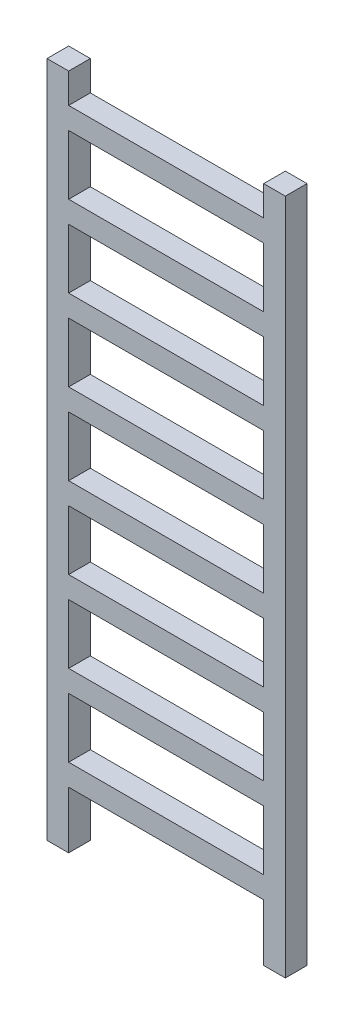
ISO-10303-21;
HEADER;
FILE_DESCRIPTION(('STEP AP214'),'2;1');
FILE_NAME('part.step','',(''),(''),'','','');
FILE_SCHEMA(('AUTOMOTIVE_DESIGN { 1 0 10303 214 1 1 1 1 }'));
ENDSEC;
DATA;
#1=APPLICATION_CONTEXT('core data for automotive mechanical design processes');
#2=APPLICATION_PROTOCOL_DEFINITION('international standard','automotive_design',2000,#1);
#3=PRODUCT_CONTEXT('',#1,'mechanical');
#4=PRODUCT('Part','Part','',(#3));
#5=PRODUCT_RELATED_PRODUCT_CATEGORY('part','',(#4));
#6=PRODUCT_DEFINITION_FORMATION('','',#4);
#7=PRODUCT_DEFINITION_CONTEXT('part definition',#1,'design');
#8=PRODUCT_DEFINITION('design','',#6,#7);
#9=PRODUCT_DEFINITION_SHAPE('','',#8);
#10=(LENGTH_UNIT() NAMED_UNIT(*) SI_UNIT(.MILLI.,.METRE.));
#11=(NAMED_UNIT(*) PLANE_ANGLE_UNIT() SI_UNIT($,.RADIAN.));
#12=(NAMED_UNIT(*) SI_UNIT($,.STERADIAN.) SOLID_ANGLE_UNIT());
#13=UNCERTAINTY_MEASURE_WITH_UNIT(LENGTH_MEASURE(1.E-05),#10,'distance_accuracy_value','');
#14=(GEOMETRIC_REPRESENTATION_CONTEXT(3) GLOBAL_UNCERTAINTY_ASSIGNED_CONTEXT((#13)) GLOBAL_UNIT_ASSIGNED_CONTEXT((#10,
#11,#12)) REPRESENTATION_CONTEXT('',''));
#15=CARTESIAN_POINT('',(0.,0.,0.));
#16=DIRECTION('',(0.,0.,1.));
#17=DIRECTION('',(1.,0.,0.));
#18=AXIS2_PLACEMENT_3D('',#15,#16,#17);
#19=CARTESIAN_POINT('',(-360.,-1250.,80.));
#20=DIRECTION('',(-1.,0.,0.));
#21=DIRECTION('',(0.,0.,1.));
#22=AXIS2_PLACEMENT_3D('',#19,#20,#21);
#23=PLANE('',#22);
#24=DIRECTION('',(0.,0.,1.));
#25=VECTOR('',#24,1.);
#26=CARTESIAN_POINT('',(-360.,-960.,80.));
#27=LINE('',#26,#25);
#28=CARTESIAN_POINT('',(-360.,-960.,0.));
#29=VERTEX_POINT('',#28);
#30=CARTESIAN_POINT('',(-360.,-960.,80.));
#31=VERTEX_POINT('',#30);
#32=EDGE_CURVE('E333',#29,#31,#27,.T.);
#33=ORIENTED_EDGE('',*,*,#32,.F.);
#34=DIRECTION('',(0.,1.,0.));
#35=VECTOR('',#34,1.);
#36=CARTESIAN_POINT('',(-360.,-1250.,0.));
#37=LINE('',#36,#35);
#38=CARTESIAN_POINT('',(-360.,-740.,0.));
#39=VERTEX_POINT('',#38);
#40=EDGE_CURVE('E537',#29,#39,#37,.T.);
#41=ORIENTED_EDGE('',*,*,#40,.T.);
#42=DIRECTION('',(0.,0.,-1.));
#43=VECTOR('',#42,1.);
#44=CARTESIAN_POINT('',(-360.,-740.,80.));
#45=LINE('',#44,#43);
#46=CARTESIAN_POINT('',(-360.,-740.,80.));
#47=VERTEX_POINT('',#46);
#48=EDGE_CURVE('E351',#47,#39,#45,.T.);
#49=ORIENTED_EDGE('',*,*,#48,.F.);
#50=DIRECTION('',(0.,1.,0.));
#51=VECTOR('',#50,1.);
#52=CARTESIAN_POINT('',(-360.,-1250.,80.));
#53=LINE('',#52,#51);
#54=EDGE_CURVE('E526',#31,#47,#53,.T.);
#55=ORIENTED_EDGE('',*,*,#54,.F.);
#56=EDGE_LOOP('',(#33,#41,#49,#55));
#57=FACE_BOUND('',#56,.T.);
#58=ADVANCED_FACE('F41',(#57),#23,.F.);
#59=DIRECTION('',(0.,0.,-1.));
#60=VECTOR('',#59,1.);
#61=CARTESIAN_POINT('',(-360.,-1040.,80.));
#62=LINE('',#61,#60);
#63=CARTESIAN_POINT('',(-360.,-1040.,80.));
#64=VERTEX_POINT('',#63);
#65=CARTESIAN_POINT('',(-360.,-1040.,0.));
#66=VERTEX_POINT('',#65);
#67=EDGE_CURVE('E317',#64,#66,#62,.T.);
#68=ORIENTED_EDGE('',*,*,#67,.F.);
#69=CARTESIAN_POINT('',(-360.,-1250.,80.));
#70=VERTEX_POINT('',#69);
#71=EDGE_CURVE('E522',#70,#64,#53,.T.);
#72=ORIENTED_EDGE('',*,*,#71,.F.);
#73=DIRECTION('',(0.,0.,-1.));
#74=VECTOR('',#73,1.);
#75=CARTESIAN_POINT('',(-360.,-1250.,80.));
#76=LINE('',#75,#74);
#77=CARTESIAN_POINT('',(-360.,-1250.,0.));
#78=VERTEX_POINT('',#77);
#79=EDGE_CURVE('E533',#70,#78,#76,.T.);
#80=ORIENTED_EDGE('',*,*,#79,.T.);
#81=EDGE_CURVE('E534',#78,#66,#37,.T.);
#82=ORIENTED_EDGE('',*,*,#81,.T.);
#83=EDGE_LOOP('',(#68,#72,#80,#82));
#84=FACE_BOUND('',#83,.T.);
#85=ADVANCED_FACE('F724',(#84),#23,.F.);
#86=CARTESIAN_POINT('',(360.,-1250.,80.));
#87=DIRECTION('',(1.,0.,0.));
#88=DIRECTION('',(0.,0.,-1.));
#89=AXIS2_PLACEMENT_3D('',#86,#87,#88);
#90=PLANE('',#89);
#91=DIRECTION('',(0.,0.,-1.));
#92=VECTOR('',#91,1.);
#93=CARTESIAN_POINT('',(360.,-960.,80.));
#94=LINE('',#93,#92);
#95=CARTESIAN_POINT('',(360.,-960.,80.));
#96=VERTEX_POINT('',#95);
#97=CARTESIAN_POINT('',(360.,-960.,0.));
#98=VERTEX_POINT('',#97);
#99=EDGE_CURVE('E64',#96,#98,#94,.T.);
#100=ORIENTED_EDGE('',*,*,#99,.F.);
#101=DIRECTION('',(0.,-1.,0.));
#102=VECTOR('',#101,1.);
#103=CARTESIAN_POINT('',(360.,-1250.,80.));
#104=LINE('',#103,#102);
#105=CARTESIAN_POINT('',(360.,-740.,80.));
#106=VERTEX_POINT('',#105);
#107=EDGE_CURVE('E607',#106,#96,#104,.T.);
#108=ORIENTED_EDGE('',*,*,#107,.F.);
#109=DIRECTION('',(0.,0.,1.));
#110=VECTOR('',#109,1.);
#111=CARTESIAN_POINT('',(360.,-740.,80.));
#112=LINE('',#111,#110);
#113=CARTESIAN_POINT('',(360.,-740.,0.));
#114=VERTEX_POINT('',#113);
#115=EDGE_CURVE('E344',#114,#106,#112,.T.);
#116=ORIENTED_EDGE('',*,*,#115,.F.);
#117=DIRECTION('',(0.,-1.,0.));
#118=VECTOR('',#117,1.);
#119=CARTESIAN_POINT('',(360.,-1250.,0.));
#120=LINE('',#119,#118);
#121=EDGE_CURVE('E308',#114,#98,#120,.T.);
#122=ORIENTED_EDGE('',*,*,#121,.T.);
#123=EDGE_LOOP('',(#100,#108,#116,#122));
#124=FACE_BOUND('',#123,.T.);
#125=ADVANCED_FACE('F594',(#124),#90,.F.);
#126=DIRECTION('',(0.,0.,1.));
#127=VECTOR('',#126,1.);
#128=CARTESIAN_POINT('',(360.,-1040.,80.));
#129=LINE('',#128,#127);
#130=CARTESIAN_POINT('',(360.,-1040.,0.));
#131=VERTEX_POINT('',#130);
#132=CARTESIAN_POINT('',(360.,-1040.,80.));
#133=VERTEX_POINT('',#132);
#134=EDGE_CURVE('E312',#131,#133,#129,.T.);
#135=ORIENTED_EDGE('',*,*,#134,.F.);
#136=CARTESIAN_POINT('',(360.,-1250.,0.));
#137=VERTEX_POINT('',#136);
#138=EDGE_CURVE('E299',#131,#137,#120,.T.);
#139=ORIENTED_EDGE('',*,*,#138,.T.);
#140=DIRECTION('',(0.,0.,-1.));
#141=VECTOR('',#140,1.);
#142=CARTESIAN_POINT('',(360.,-1250.,80.));
#143=LINE('',#142,#141);
#144=CARTESIAN_POINT('',(360.,-1250.,80.));
#145=VERTEX_POINT('',#144);
#146=EDGE_CURVE('E495',#145,#137,#143,.T.);
#147=ORIENTED_EDGE('',*,*,#146,.F.);
#148=EDGE_CURVE('E56',#133,#145,#104,.T.);
#149=ORIENTED_EDGE('',*,*,#148,.F.);
#150=EDGE_LOOP('',(#135,#139,#147,#149));
#151=FACE_BOUND('',#150,.T.);
#152=ADVANCED_FACE('F313',(#151),#90,.F.);
#153=DIRECTION('',(0.,0.,1.));
#154=VECTOR('',#153,1.);
#155=CARTESIAN_POINT('',(-360.,-660.,80.));
#156=LINE('',#155,#154);
#157=CARTESIAN_POINT('',(-360.,-660.,0.));
#158=VERTEX_POINT('',#157);
#159=CARTESIAN_POINT('',(-360.,-660.,80.));
#160=VERTEX_POINT('',#159);
#161=EDGE_CURVE('E357',#158,#160,#156,.T.);
#162=ORIENTED_EDGE('',*,*,#161,.F.);
#163=CARTESIAN_POINT('',(-360.,-440.,0.));
#164=VERTEX_POINT('',#163);
#165=EDGE_CURVE('E604',#158,#164,#37,.T.);
#166=ORIENTED_EDGE('',*,*,#165,.T.);
#167=DIRECTION('',(0.,0.,-1.));
#168=VECTOR('',#167,1.);
#169=CARTESIAN_POINT('',(-360.,-440.,80.));
#170=LINE('',#169,#168);
#171=CARTESIAN_POINT('',(-360.,-440.,80.));
#172=VERTEX_POINT('',#171);
#173=EDGE_CURVE('E375',#172,#164,#170,.T.);
#174=ORIENTED_EDGE('',*,*,#173,.F.);
#175=EDGE_CURVE('E678',#160,#172,#53,.T.);
#176=ORIENTED_EDGE('',*,*,#175,.F.);
#177=EDGE_LOOP('',(#162,#166,#174,#176));
#178=FACE_BOUND('',#177,.T.);
#179=ADVANCED_FACE('F701',(#178),#23,.F.);
#180=DIRECTION('',(0.,0.,-1.));
#181=VECTOR('',#180,1.);
#182=CARTESIAN_POINT('',(360.,-660.,80.));
#183=LINE('',#182,#181);
#184=CARTESIAN_POINT('',(360.,-660.,80.));
#185=VERTEX_POINT('',#184);
#186=CARTESIAN_POINT('',(360.,-660.,0.));
#187=VERTEX_POINT('',#186);
#188=EDGE_CURVE('E354',#185,#187,#183,.T.);
#189=ORIENTED_EDGE('',*,*,#188,.F.);
#190=CARTESIAN_POINT('',(360.,-440.,80.));
#191=VERTEX_POINT('',#190);
#192=EDGE_CURVE('E609',#191,#185,#104,.T.);
#193=ORIENTED_EDGE('',*,*,#192,.F.);
#194=DIRECTION('',(0.,0.,1.));
#195=VECTOR('',#194,1.);
#196=CARTESIAN_POINT('',(360.,-440.,80.));
#197=LINE('',#196,#195);
#198=CARTESIAN_POINT('',(360.,-440.,0.));
#199=VERTEX_POINT('',#198);
#200=EDGE_CURVE('E368',#199,#191,#197,.T.);
#201=ORIENTED_EDGE('',*,*,#200,.F.);
#202=EDGE_CURVE('E588',#199,#187,#120,.T.);
#203=ORIENTED_EDGE('',*,*,#202,.T.);
#204=EDGE_LOOP('',(#189,#193,#201,#203));
#205=FACE_BOUND('',#204,.T.);
#206=ADVANCED_FACE('F708',(#205),#90,.F.);
#207=DIRECTION('',(0.,0.,1.));
#208=VECTOR('',#207,1.);
#209=CARTESIAN_POINT('',(-360.,-360.,80.));
#210=LINE('',#209,#208);
#211=CARTESIAN_POINT('',(-360.,-360.,0.));
#212=VERTEX_POINT('',#211);
#213=CARTESIAN_POINT('',(-360.,-360.,80.));
#214=VERTEX_POINT('',#213);
#215=EDGE_CURVE('E381',#212,#214,#210,.T.);
#216=ORIENTED_EDGE('',*,*,#215,.F.);
#217=CARTESIAN_POINT('',(-360.,-140.,0.));
#218=VERTEX_POINT('',#217);
#219=EDGE_CURVE('E676',#212,#218,#37,.T.);
#220=ORIENTED_EDGE('',*,*,#219,.T.);
#221=DIRECTION('',(0.,0.,-1.));
#222=VECTOR('',#221,1.);
#223=CARTESIAN_POINT('',(-360.,-140.,80.));
#224=LINE('',#223,#222);
#225=CARTESIAN_POINT('',(-360.,-140.,80.));
#226=VERTEX_POINT('',#225);
#227=EDGE_CURVE('E399',#226,#218,#224,.T.);
#228=ORIENTED_EDGE('',*,*,#227,.F.);
#229=EDGE_CURVE('E677',#214,#226,#53,.T.);
#230=ORIENTED_EDGE('',*,*,#229,.F.);
#231=EDGE_LOOP('',(#216,#220,#228,#230));
#232=FACE_BOUND('',#231,.T.);
#233=ADVANCED_FACE('F674',(#232),#23,.F.);
#234=DIRECTION('',(0.,0.,-1.));
#235=VECTOR('',#234,1.);
#236=CARTESIAN_POINT('',(360.,-360.,80.));
#237=LINE('',#236,#235);
#238=CARTESIAN_POINT('',(360.,-360.,80.));
#239=VERTEX_POINT('',#238);
#240=CARTESIAN_POINT('',(360.,-360.,0.));
#241=VERTEX_POINT('',#240);
#242=EDGE_CURVE('E378',#239,#241,#237,.T.);
#243=ORIENTED_EDGE('',*,*,#242,.F.);
#244=CARTESIAN_POINT('',(360.,-140.,80.));
#245=VERTEX_POINT('',#244);
#246=EDGE_CURVE('E611',#245,#239,#104,.T.);
#247=ORIENTED_EDGE('',*,*,#246,.F.);
#248=DIRECTION('',(0.,0.,1.));
#249=VECTOR('',#248,1.);
#250=CARTESIAN_POINT('',(360.,-140.,80.));
#251=LINE('',#250,#249);
#252=CARTESIAN_POINT('',(360.,-140.,0.));
#253=VERTEX_POINT('',#252);
#254=EDGE_CURVE('E392',#253,#245,#251,.T.);
#255=ORIENTED_EDGE('',*,*,#254,.F.);
#256=EDGE_CURVE('E585',#253,#241,#120,.T.);
#257=ORIENTED_EDGE('',*,*,#256,.T.);
#258=EDGE_LOOP('',(#243,#247,#255,#257));
#259=FACE_BOUND('',#258,.T.);
#260=ADVANCED_FACE('F759',(#259),#90,.F.);
#261=DIRECTION('',(0.,0.,1.));
#262=VECTOR('',#261,1.);
#263=CARTESIAN_POINT('',(-360.,-60.0000000000001,80.));
#264=LINE('',#263,#262);
#265=CARTESIAN_POINT('',(-360.,-60.,0.));
#266=VERTEX_POINT('',#265);
#267=CARTESIAN_POINT('',(-360.,-60.0000000000001,80.));
#268=VERTEX_POINT('',#267);
#269=EDGE_CURVE('E405',#266,#268,#264,.T.);
#270=ORIENTED_EDGE('',*,*,#269,.F.);
#271=CARTESIAN_POINT('',(-360.,160.,0.));
#272=VERTEX_POINT('',#271);
#273=EDGE_CURVE('E695',#266,#272,#37,.T.);
#274=ORIENTED_EDGE('',*,*,#273,.T.);
#275=DIRECTION('',(0.,0.,-1.));
#276=VECTOR('',#275,1.);
#277=CARTESIAN_POINT('',(-360.,160.,80.));
#278=LINE('',#277,#276);
#279=CARTESIAN_POINT('',(-360.,160.,80.));
#280=VERTEX_POINT('',#279);
#281=EDGE_CURVE('E423',#280,#272,#278,.T.);
#282=ORIENTED_EDGE('',*,*,#281,.F.);
#283=EDGE_CURVE('E679',#268,#280,#53,.T.);
#284=ORIENTED_EDGE('',*,*,#283,.F.);
#285=EDGE_LOOP('',(#270,#274,#282,#284));
#286=FACE_BOUND('',#285,.T.);
#287=ADVANCED_FACE('F754',(#286),#23,.F.);
#288=DIRECTION('',(0.,0.,-1.));
#289=VECTOR('',#288,1.);
#290=CARTESIAN_POINT('',(360.,-60.0000000000001,80.));
#291=LINE('',#290,#289);
#292=CARTESIAN_POINT('',(360.,-60.0000000000001,80.));
#293=VERTEX_POINT('',#292);
#294=CARTESIAN_POINT('',(360.,-60.0000000000001,0.));
#295=VERTEX_POINT('',#294);
#296=EDGE_CURVE('E402',#293,#295,#291,.T.);
#297=ORIENTED_EDGE('',*,*,#296,.F.);
#298=CARTESIAN_POINT('',(360.,160.,80.));
#299=VERTEX_POINT('',#298);
#300=EDGE_CURVE('E659',#299,#293,#104,.T.);
#301=ORIENTED_EDGE('',*,*,#300,.F.);
#302=DIRECTION('',(0.,0.,1.));
#303=VECTOR('',#302,1.);
#304=CARTESIAN_POINT('',(360.,160.,80.));
#305=LINE('',#304,#303);
#306=CARTESIAN_POINT('',(360.,160.,0.));
#307=VERTEX_POINT('',#306);
#308=EDGE_CURVE('E416',#307,#299,#305,.T.);
#309=ORIENTED_EDGE('',*,*,#308,.F.);
#310=EDGE_CURVE('E582',#307,#295,#120,.T.);
#311=ORIENTED_EDGE('',*,*,#310,.T.);
#312=EDGE_LOOP('',(#297,#301,#309,#311));
#313=FACE_BOUND('',#312,.T.);
#314=ADVANCED_FACE('F752',(#313),#90,.F.);
#315=DIRECTION('',(0.,0.,1.));
#316=VECTOR('',#315,1.);
#317=CARTESIAN_POINT('',(-360.,240.,80.));
#318=LINE('',#317,#316);
#319=CARTESIAN_POINT('',(-360.,240.,0.));
#320=VERTEX_POINT('',#319);
#321=CARTESIAN_POINT('',(-360.,240.,80.));
#322=VERTEX_POINT('',#321);
#323=EDGE_CURVE('E429',#320,#322,#318,.T.);
#324=ORIENTED_EDGE('',*,*,#323,.F.);
#325=CARTESIAN_POINT('',(-360.,460.,0.));
#326=VERTEX_POINT('',#325);
#327=EDGE_CURVE('E686',#320,#326,#37,.T.);
#328=ORIENTED_EDGE('',*,*,#327,.T.);
#329=DIRECTION('',(0.,0.,-1.));
#330=VECTOR('',#329,1.);
#331=CARTESIAN_POINT('',(-360.,460.,80.));
#332=LINE('',#331,#330);
#333=CARTESIAN_POINT('',(-360.,460.,80.));
#334=VERTEX_POINT('',#333);
#335=EDGE_CURVE('E447',#334,#326,#332,.T.);
#336=ORIENTED_EDGE('',*,*,#335,.F.);
#337=EDGE_CURVE('E573',#322,#334,#53,.T.);
#338=ORIENTED_EDGE('',*,*,#337,.F.);
#339=EDGE_LOOP('',(#324,#328,#336,#338));
#340=FACE_BOUND('',#339,.T.);
#341=ADVANCED_FACE('F685',(#340),#23,.F.);
#342=DIRECTION('',(0.,0.,-1.));
#343=VECTOR('',#342,1.);
#344=CARTESIAN_POINT('',(360.,240.,80.));
#345=LINE('',#344,#343);
#346=CARTESIAN_POINT('',(360.,240.,80.));
#347=VERTEX_POINT('',#346);
#348=CARTESIAN_POINT('',(360.,240.,0.));
#349=VERTEX_POINT('',#348);
#350=EDGE_CURVE('E426',#347,#349,#345,.T.);
#351=ORIENTED_EDGE('',*,*,#350,.F.);
#352=CARTESIAN_POINT('',(360.,460.,80.));
#353=VERTEX_POINT('',#352);
#354=EDGE_CURVE('E657',#353,#347,#104,.T.);
#355=ORIENTED_EDGE('',*,*,#354,.F.);
#356=DIRECTION('',(0.,0.,1.));
#357=VECTOR('',#356,1.);
#358=CARTESIAN_POINT('',(360.,460.,80.));
#359=LINE('',#358,#357);
#360=CARTESIAN_POINT('',(360.,460.,0.));
#361=VERTEX_POINT('',#360);
#362=EDGE_CURVE('E440',#361,#353,#359,.T.);
#363=ORIENTED_EDGE('',*,*,#362,.F.);
#364=EDGE_CURVE('E581',#361,#349,#120,.T.);
#365=ORIENTED_EDGE('',*,*,#364,.T.);
#366=EDGE_LOOP('',(#351,#355,#363,#365));
#367=FACE_BOUND('',#366,.T.);
#368=ADVANCED_FACE('F690',(#367),#90,.F.);
#369=DIRECTION('',(0.,0.,1.));
#370=VECTOR('',#369,1.);
#371=CARTESIAN_POINT('',(-360.,540.,80.));
#372=LINE('',#371,#370);
#373=CARTESIAN_POINT('',(-360.,540.,0.));
#374=VERTEX_POINT('',#373);
#375=CARTESIAN_POINT('',(-360.,540.,80.));
#376=VERTEX_POINT('',#375);
#377=EDGE_CURVE('E453',#374,#376,#372,.T.);
#378=ORIENTED_EDGE('',*,*,#377,.F.);
#379=CARTESIAN_POINT('',(-360.,760.,0.));
#380=VERTEX_POINT('',#379);
#381=EDGE_CURVE('E576',#374,#380,#37,.T.);
#382=ORIENTED_EDGE('',*,*,#381,.T.);
#383=DIRECTION('',(0.,0.,-1.));
#384=VECTOR('',#383,1.);
#385=CARTESIAN_POINT('',(-360.,760.,80.));
#386=LINE('',#385,#384);
#387=CARTESIAN_POINT('',(-360.,760.,80.));
#388=VERTEX_POINT('',#387);
#389=EDGE_CURVE('E464',#388,#380,#386,.T.);
#390=ORIENTED_EDGE('',*,*,#389,.F.);
#391=EDGE_CURVE('E569',#376,#388,#53,.T.);
#392=ORIENTED_EDGE('',*,*,#391,.F.);
#393=EDGE_LOOP('',(#378,#382,#390,#392));
#394=FACE_BOUND('',#393,.T.);
#395=ADVANCED_FACE('F575',(#394),#23,.F.);
#396=DIRECTION('',(0.,0.,-1.));
#397=VECTOR('',#396,1.);
#398=CARTESIAN_POINT('',(360.,540.,80.));
#399=LINE('',#398,#397);
#400=CARTESIAN_POINT('',(360.,540.,80.));
#401=VERTEX_POINT('',#400);
#402=CARTESIAN_POINT('',(360.,540.,0.));
#403=VERTEX_POINT('',#402);
#404=EDGE_CURVE('E450',#401,#403,#399,.T.);
#405=ORIENTED_EDGE('',*,*,#404,.F.);
#406=CARTESIAN_POINT('',(360.,760.,80.));
#407=VERTEX_POINT('',#406);
#408=EDGE_CURVE('E567',#407,#401,#104,.T.);
#409=ORIENTED_EDGE('',*,*,#408,.F.);
#410=DIRECTION('',(0.,0.,1.));
#411=VECTOR('',#410,1.);
#412=CARTESIAN_POINT('',(360.,760.,80.));
#413=LINE('',#412,#411);
#414=CARTESIAN_POINT('',(360.,760.,0.));
#415=VERTEX_POINT('',#414);
#416=EDGE_CURVE('E49',#415,#407,#413,.T.);
#417=ORIENTED_EDGE('',*,*,#416,.F.);
#418=EDGE_CURVE('E580',#415,#403,#120,.T.);
#419=ORIENTED_EDGE('',*,*,#418,.T.);
#420=EDGE_LOOP('',(#405,#409,#417,#419));
#421=FACE_BOUND('',#420,.T.);
#422=ADVANCED_FACE('F740',(#421),#90,.F.);
#423=DIRECTION('',(0.,0.,1.));
#424=VECTOR('',#423,1.);
#425=CARTESIAN_POINT('',(-360.,840.,80.));
#426=LINE('',#425,#424);
#427=CARTESIAN_POINT('',(-360.,840.,0.));
#428=VERTEX_POINT('',#427);
#429=CARTESIAN_POINT('',(-360.,840.,80.));
#430=VERTEX_POINT('',#429);
#431=EDGE_CURVE('E471',#428,#430,#426,.T.);
#432=ORIENTED_EDGE('',*,*,#431,.F.);
#433=CARTESIAN_POINT('',(-360.,1060.,0.));
#434=VERTEX_POINT('',#433);
#435=EDGE_CURVE('E637',#428,#434,#37,.T.);
#436=ORIENTED_EDGE('',*,*,#435,.T.);
#437=DIRECTION('',(0.,0.,-1.));
#438=VECTOR('',#437,1.);
#439=CARTESIAN_POINT('',(-360.,1060.,80.));
#440=LINE('',#439,#438);
#441=CARTESIAN_POINT('',(-360.,1060.,80.));
#442=VERTEX_POINT('',#441);
#443=EDGE_CURVE('E513',#442,#434,#440,.T.);
#444=ORIENTED_EDGE('',*,*,#443,.F.);
#445=EDGE_CURVE('E574',#430,#442,#53,.T.);
#446=ORIENTED_EDGE('',*,*,#445,.F.);
#447=EDGE_LOOP('',(#432,#436,#444,#446));
#448=FACE_BOUND('',#447,.T.);
#449=ADVANCED_FACE('F647',(#448),#23,.F.);
#450=DIRECTION('',(0.,0.,-1.));
#451=VECTOR('',#450,1.);
#452=CARTESIAN_POINT('',(360.,840.,80.));
#453=LINE('',#452,#451);
#454=CARTESIAN_POINT('',(360.,840.,80.));
#455=VERTEX_POINT('',#454);
#456=CARTESIAN_POINT('',(360.,840.,0.));
#457=VERTEX_POINT('',#456);
#458=EDGE_CURVE('E11',#455,#457,#453,.T.);
#459=ORIENTED_EDGE('',*,*,#458,.F.);
#460=CARTESIAN_POINT('',(360.,1060.,80.));
#461=VERTEX_POINT('',#460);
#462=EDGE_CURVE('E484',#461,#455,#104,.T.);
#463=ORIENTED_EDGE('',*,*,#462,.F.);
#464=DIRECTION('',(0.,0.,-1.));
#465=VECTOR('',#464,1.);
#466=CARTESIAN_POINT('',(360.,1060.,80.));
#467=LINE('',#466,#465);
#468=CARTESIAN_POINT('',(360.,1060.,0.));
#469=VERTEX_POINT('',#468);
#470=EDGE_CURVE('E554',#461,#469,#467,.T.);
#471=ORIENTED_EDGE('',*,*,#470,.T.);
#472=EDGE_CURVE('E491',#469,#457,#120,.T.);
#473=ORIENTED_EDGE('',*,*,#472,.T.);
#474=EDGE_LOOP('',(#459,#463,#471,#473));
#475=FACE_BOUND('',#474,.T.);
#476=ADVANCED_FACE('F653',(#475),#90,.F.);
#477=CARTESIAN_POINT('',(-400.,1140.,80.));
#478=DIRECTION('',(0.,-1.,0.));
#479=DIRECTION('',(0.,0.,-1.));
#480=AXIS2_PLACEMENT_3D('',#477,#478,#479);
#481=PLANE('',#480);
#482=DIRECTION('',(0.,0.,1.));
#483=VECTOR('',#482,1.);
#484=CARTESIAN_POINT('',(360.,1140.,80.));
#485=LINE('',#484,#483);
#486=CARTESIAN_POINT('',(360.,1140.,0.));
#487=VERTEX_POINT('',#486);
#488=CARTESIAN_POINT('',(360.,1140.,80.));
#489=VERTEX_POINT('',#488);
#490=EDGE_CURVE('E503',#487,#489,#485,.T.);
#491=ORIENTED_EDGE('',*,*,#490,.F.);
#492=DIRECTION('',(-1.,0.,0.));
#493=VECTOR('',#492,1.);
#494=CARTESIAN_POINT('',(-400.,1140.,0.));
#495=LINE('',#494,#493);
#496=CARTESIAN_POINT('',(-360.,1140.,0.));
#497=VERTEX_POINT('',#496);
#498=EDGE_CURVE('E506',#487,#497,#495,.T.);
#499=ORIENTED_EDGE('',*,*,#498,.T.);
#500=DIRECTION('',(0.,0.,1.));
#501=VECTOR('',#500,1.);
#502=CARTESIAN_POINT('',(-360.,1140.,80.));
#503=LINE('',#502,#501);
#504=CARTESIAN_POINT('',(-360.,1140.,80.));
#505=VERTEX_POINT('',#504);
#506=EDGE_CURVE('E518',#497,#505,#503,.T.);
#507=ORIENTED_EDGE('',*,*,#506,.T.);
#508=DIRECTION('',(-1.,0.,0.));
#509=VECTOR('',#508,1.);
#510=CARTESIAN_POINT('',(-400.,1140.,80.));
#511=LINE('',#510,#509);
#512=EDGE_CURVE('E507',#489,#505,#511,.T.);
#513=ORIENTED_EDGE('',*,*,#512,.F.);
#514=EDGE_LOOP('',(#491,#499,#507,#513));
#515=FACE_BOUND('',#514,.T.);
#516=ADVANCED_FACE('F630',(#515),#481,.F.);
#517=CARTESIAN_POINT('',(-400.,1060.,80.));
#518=DIRECTION('',(0.,1.,0.));
#519=DIRECTION('',(0.,0.,1.));
#520=AXIS2_PLACEMENT_3D('',#517,#518,#519);
#521=PLANE('',#520);
#522=ORIENTED_EDGE('',*,*,#470,.F.);
#523=DIRECTION('',(1.,0.,0.));
#524=VECTOR('',#523,1.);
#525=CARTESIAN_POINT('',(-400.,1060.,80.));
#526=LINE('',#525,#524);
#527=EDGE_CURVE('E509',#442,#461,#526,.T.);
#528=ORIENTED_EDGE('',*,*,#527,.F.);
#529=ORIENTED_EDGE('',*,*,#443,.T.);
#530=DIRECTION('',(1.,0.,0.));
#531=VECTOR('',#530,1.);
#532=CARTESIAN_POINT('',(-400.,1060.,0.));
#533=LINE('',#532,#531);
#534=EDGE_CURVE('E510',#434,#469,#533,.T.);
#535=ORIENTED_EDGE('',*,*,#534,.T.);
#536=EDGE_LOOP('',(#522,#528,#529,#535));
#537=FACE_BOUND('',#536,.T.);
#538=ADVANCED_FACE('F650',(#537),#521,.F.);
#539=ORIENTED_EDGE('',*,*,#506,.F.);
#540=CARTESIAN_POINT('',(-360.,1250.,0.));
#541=VERTEX_POINT('',#540);
#542=EDGE_CURVE('E521',#497,#541,#37,.T.);
#543=ORIENTED_EDGE('',*,*,#542,.T.);
#544=DIRECTION('',(0.,0.,-1.));
#545=VECTOR('',#544,1.);
#546=CARTESIAN_POINT('',(-360.,1250.,80.));
#547=LINE('',#546,#545);
#548=CARTESIAN_POINT('',(-360.,1250.,80.));
#549=VERTEX_POINT('',#548);
#550=EDGE_CURVE('E551',#549,#541,#547,.T.);
#551=ORIENTED_EDGE('',*,*,#550,.F.);
#552=EDGE_CURVE('E527',#505,#549,#53,.T.);
#553=ORIENTED_EDGE('',*,*,#552,.F.);
#554=EDGE_LOOP('',(#539,#543,#551,#553));
#555=FACE_BOUND('',#554,.T.);
#556=ADVANCED_FACE('F43',(#555),#23,.F.);
#557=CARTESIAN_POINT('',(-440.,1250.,80.));
#558=DIRECTION('',(0.,-1.,0.));
#559=DIRECTION('',(0.,0.,-1.));
#560=AXIS2_PLACEMENT_3D('',#557,#558,#559);
#561=PLANE('',#560);
#562=DIRECTION('',(-1.,0.,0.));
#563=VECTOR('',#562,1.);
#564=CARTESIAN_POINT('',(-440.,1250.,0.));
#565=LINE('',#564,#563);
#566=CARTESIAN_POINT('',(-440.,1250.,0.));
#567=VERTEX_POINT('',#566);
#568=EDGE_CURVE('E536',#541,#567,#565,.T.);
#569=ORIENTED_EDGE('',*,*,#568,.T.);
#570=DIRECTION('',(0.,0.,-1.));
#571=VECTOR('',#570,1.);
#572=CARTESIAN_POINT('',(-440.,1250.,80.));
#573=LINE('',#572,#571);
#574=CARTESIAN_POINT('',(-440.,1250.,80.));
#575=VERTEX_POINT('',#574);
#576=EDGE_CURVE('E548',#575,#567,#573,.T.);
#577=ORIENTED_EDGE('',*,*,#576,.F.);
#578=DIRECTION('',(-1.,0.,0.));
#579=VECTOR('',#578,1.);
#580=CARTESIAN_POINT('',(-440.,1250.,80.));
#581=LINE('',#580,#579);
#582=EDGE_CURVE('E525',#549,#575,#581,.T.);
#583=ORIENTED_EDGE('',*,*,#582,.F.);
#584=ORIENTED_EDGE('',*,*,#550,.T.);
#585=EDGE_LOOP('',(#569,#577,#583,#584));
#586=FACE_BOUND('',#585,.T.);
#587=ADVANCED_FACE('F730',(#586),#561,.F.);
#588=CARTESIAN_POINT('',(-440.,-1250.,80.));
#589=DIRECTION('',(1.,0.,0.));
#590=DIRECTION('',(0.,0.,-1.));
#591=AXIS2_PLACEMENT_3D('',#588,#589,#590);
#592=PLANE('',#591);
#593=DIRECTION('',(0.,-1.,0.));
#594=VECTOR('',#593,1.);
#595=CARTESIAN_POINT('',(-440.,-1250.,0.));
#596=LINE('',#595,#594);
#597=CARTESIAN_POINT('',(-440.,-1250.,0.));
#598=VERTEX_POINT('',#597);
#599=EDGE_CURVE('E539',#567,#598,#596,.T.);
#600=ORIENTED_EDGE('',*,*,#599,.T.);
#601=DIRECTION('',(0.,0.,-1.));
#602=VECTOR('',#601,1.);
#603=CARTESIAN_POINT('',(-440.,-1250.,80.));
#604=LINE('',#603,#602);
#605=CARTESIAN_POINT('',(-440.,-1250.,80.));
#606=VERTEX_POINT('',#605);
#607=EDGE_CURVE('E545',#606,#598,#604,.T.);
#608=ORIENTED_EDGE('',*,*,#607,.F.);
#609=DIRECTION('',(0.,-1.,0.));
#610=VECTOR('',#609,1.);
#611=CARTESIAN_POINT('',(-440.,-1250.,80.));
#612=LINE('',#611,#610);
#613=EDGE_CURVE('E529',#575,#606,#612,.T.);
#614=ORIENTED_EDGE('',*,*,#613,.F.);
#615=ORIENTED_EDGE('',*,*,#576,.T.);
#616=EDGE_LOOP('',(#600,#608,#614,#615));
#617=FACE_BOUND('',#616,.T.);
#618=ADVANCED_FACE('F736',(#617),#592,.F.);
#619=CARTESIAN_POINT('',(-440.,-1250.,80.));
#620=DIRECTION('',(0.,1.,0.));
#621=DIRECTION('',(0.,0.,1.));
#622=AXIS2_PLACEMENT_3D('',#619,#620,#621);
#623=PLANE('',#622);
#624=DIRECTION('',(1.,0.,0.));
#625=VECTOR('',#624,1.);
#626=CARTESIAN_POINT('',(-440.,-1250.,0.));
#627=LINE('',#626,#625);
#628=EDGE_CURVE('E541',#598,#78,#627,.T.);
#629=ORIENTED_EDGE('',*,*,#628,.T.);
#630=ORIENTED_EDGE('',*,*,#79,.F.);
#631=DIRECTION('',(1.,0.,0.));
#632=VECTOR('',#631,1.);
#633=CARTESIAN_POINT('',(-440.,-1250.,80.));
#634=LINE('',#633,#632);
#635=EDGE_CURVE('E531',#606,#70,#634,.T.);
#636=ORIENTED_EDGE('',*,*,#635,.F.);
#637=ORIENTED_EDGE('',*,*,#607,.T.);
#638=EDGE_LOOP('',(#629,#630,#636,#637));
#639=FACE_BOUND('',#638,.T.);
#640=ADVANCED_FACE('F787',(#639),#623,.F.);
#641=CARTESIAN_POINT('',(0.,0.,80.));
#642=DIRECTION('',(0.,0.,-1.));
#643=DIRECTION('',(-1.,0.,0.));
#644=AXIS2_PLACEMENT_3D('',#641,#642,#643);
#645=PLANE('',#644);
#646=DIRECTION('',(-1.,0.,0.));
#647=VECTOR('',#646,1.);
#648=CARTESIAN_POINT('',(-400.,-960.,80.));
#649=LINE('',#648,#647);
#650=EDGE_CURVE('E322',#96,#31,#649,.T.);
#651=ORIENTED_EDGE('',*,*,#650,.T.);
#652=ORIENTED_EDGE('',*,*,#54,.T.);
#653=DIRECTION('',(1.,0.,0.));
#654=VECTOR('',#653,1.);
#655=CARTESIAN_POINT('',(-400.,-740.,80.));
#656=LINE('',#655,#654);
#657=EDGE_CURVE('E340',#47,#106,#656,.T.);
#658=ORIENTED_EDGE('',*,*,#657,.T.);
#659=ORIENTED_EDGE('',*,*,#107,.T.);
#660=EDGE_LOOP('',(#651,#652,#658,#659));
#661=FACE_BOUND('',#660,.T.);
#662=ORIENTED_EDGE('',*,*,#71,.T.);
#663=DIRECTION('',(1.,0.,0.));
#664=VECTOR('',#663,1.);
#665=CARTESIAN_POINT('',(-400.,-1040.,80.));
#666=LINE('',#665,#664);
#667=EDGE_CURVE('E318',#64,#133,#666,.T.);
#668=ORIENTED_EDGE('',*,*,#667,.T.);
#669=ORIENTED_EDGE('',*,*,#148,.T.);
#670=DIRECTION('',(1.,0.,0.));
#671=VECTOR('',#670,1.);
#672=CARTESIAN_POINT('',(360.,-1250.,80.));
#673=LINE('',#672,#671);
#674=CARTESIAN_POINT('',(440.,-1250.,80.));
#675=VERTEX_POINT('',#674);
#676=EDGE_CURVE('E483',#145,#675,#673,.T.);
#677=ORIENTED_EDGE('',*,*,#676,.T.);
#678=DIRECTION('',(0.,1.,0.));
#679=VECTOR('',#678,1.);
#680=CARTESIAN_POINT('',(440.,-1250.,80.));
#681=LINE('',#680,#679);
#682=CARTESIAN_POINT('',(440.,1250.,80.));
#683=VERTEX_POINT('',#682);
#684=EDGE_CURVE('E475',#675,#683,#681,.T.);
#685=ORIENTED_EDGE('',*,*,#684,.T.);
#686=DIRECTION('',(-1.,0.,0.));
#687=VECTOR('',#686,1.);
#688=CARTESIAN_POINT('',(360.,1250.,80.));
#689=LINE('',#688,#687);
#690=CARTESIAN_POINT('',(360.,1250.,80.));
#691=VERTEX_POINT('',#690);
#692=EDGE_CURVE('E478',#683,#691,#689,.T.);
#693=ORIENTED_EDGE('',*,*,#692,.T.);
#694=EDGE_CURVE('E480',#691,#489,#104,.T.);
#695=ORIENTED_EDGE('',*,*,#694,.T.);
#696=ORIENTED_EDGE('',*,*,#512,.T.);
#697=ORIENTED_EDGE('',*,*,#552,.T.);
#698=ORIENTED_EDGE('',*,*,#582,.T.);
#699=ORIENTED_EDGE('',*,*,#613,.T.);
#700=ORIENTED_EDGE('',*,*,#635,.T.);
#701=EDGE_LOOP('',(#662,#668,#669,#677,#685,#693,#695,#696,#697,#698,#699,#700));
#702=FACE_BOUND('',#701,.T.);
#703=DIRECTION('',(-1.,0.,0.));
#704=VECTOR('',#703,1.);
#705=CARTESIAN_POINT('',(-400.,-660.,80.));
#706=LINE('',#705,#704);
#707=EDGE_CURVE('E337',#185,#160,#706,.T.);
#708=ORIENTED_EDGE('',*,*,#707,.T.);
#709=ORIENTED_EDGE('',*,*,#175,.T.);
#710=DIRECTION('',(1.,0.,0.));
#711=VECTOR('',#710,1.);
#712=CARTESIAN_POINT('',(-400.,-440.,80.));
#713=LINE('',#712,#711);
#714=EDGE_CURVE('E364',#172,#191,#713,.T.);
#715=ORIENTED_EDGE('',*,*,#714,.T.);
#716=ORIENTED_EDGE('',*,*,#192,.T.);
#717=EDGE_LOOP('',(#708,#709,#715,#716));
#718=FACE_BOUND('',#717,.T.);
#719=DIRECTION('',(-1.,0.,0.));
#720=VECTOR('',#719,1.);
#721=CARTESIAN_POINT('',(-400.,-360.,80.));
#722=LINE('',#721,#720);
#723=EDGE_CURVE('E361',#239,#214,#722,.T.);
#724=ORIENTED_EDGE('',*,*,#723,.T.);
#725=ORIENTED_EDGE('',*,*,#229,.T.);
#726=DIRECTION('',(1.,0.,0.));
#727=VECTOR('',#726,1.);
#728=CARTESIAN_POINT('',(-400.,-140.,80.));
#729=LINE('',#728,#727);
#730=EDGE_CURVE('E388',#226,#245,#729,.T.);
#731=ORIENTED_EDGE('',*,*,#730,.T.);
#732=ORIENTED_EDGE('',*,*,#246,.T.);
#733=EDGE_LOOP('',(#724,#725,#731,#732));
#734=FACE_BOUND('',#733,.T.);
#735=DIRECTION('',(-1.,0.,0.));
#736=VECTOR('',#735,1.);
#737=CARTESIAN_POINT('',(-400.,-60.,80.));
#738=LINE('',#737,#736);
#739=EDGE_CURVE('E385',#293,#268,#738,.T.);
#740=ORIENTED_EDGE('',*,*,#739,.T.);
#741=ORIENTED_EDGE('',*,*,#283,.T.);
#742=DIRECTION('',(1.,0.,0.));
#743=VECTOR('',#742,1.);
#744=CARTESIAN_POINT('',(-400.,160.,80.));
#745=LINE('',#744,#743);
#746=EDGE_CURVE('E412',#280,#299,#745,.T.);
#747=ORIENTED_EDGE('',*,*,#746,.T.);
#748=ORIENTED_EDGE('',*,*,#300,.T.);
#749=EDGE_LOOP('',(#740,#741,#747,#748));
#750=FACE_BOUND('',#749,.T.);
#751=DIRECTION('',(-1.,0.,0.));
#752=VECTOR('',#751,1.);
#753=CARTESIAN_POINT('',(-400.,240.,80.));
#754=LINE('',#753,#752);
#755=EDGE_CURVE('E409',#347,#322,#754,.T.);
#756=ORIENTED_EDGE('',*,*,#755,.T.);
#757=ORIENTED_EDGE('',*,*,#337,.T.);
#758=DIRECTION('',(1.,0.,0.));
#759=VECTOR('',#758,1.);
#760=CARTESIAN_POINT('',(-400.,460.,80.));
#761=LINE('',#760,#759);
#762=EDGE_CURVE('E436',#334,#353,#761,.T.);
#763=ORIENTED_EDGE('',*,*,#762,.T.);
#764=ORIENTED_EDGE('',*,*,#354,.T.);
#765=EDGE_LOOP('',(#756,#757,#763,#764));
#766=FACE_BOUND('',#765,.T.);
#767=DIRECTION('',(-1.,0.,0.));
#768=VECTOR('',#767,1.);
#769=CARTESIAN_POINT('',(-400.,540.,80.));
#770=LINE('',#769,#768);
#771=EDGE_CURVE('E433',#401,#376,#770,.T.);
#772=ORIENTED_EDGE('',*,*,#771,.T.);
#773=ORIENTED_EDGE('',*,*,#391,.T.);
#774=DIRECTION('',(1.,0.,0.));
#775=VECTOR('',#774,1.);
#776=CARTESIAN_POINT('',(-400.,760.,80.));
#777=LINE('',#776,#775);
#778=EDGE_CURVE('E460',#388,#407,#777,.T.);
#779=ORIENTED_EDGE('',*,*,#778,.T.);
#780=ORIENTED_EDGE('',*,*,#408,.T.);
#781=EDGE_LOOP('',(#772,#773,#779,#780));
#782=FACE_BOUND('',#781,.T.);
#783=ORIENTED_EDGE('',*,*,#462,.T.);
#784=DIRECTION('',(-1.,0.,0.));
#785=VECTOR('',#784,1.);
#786=CARTESIAN_POINT('',(-400.,840.,80.));
#787=LINE('',#786,#785);
#788=EDGE_CURVE('E457',#455,#430,#787,.T.);
#789=ORIENTED_EDGE('',*,*,#788,.T.);
#790=ORIENTED_EDGE('',*,*,#445,.T.);
#791=ORIENTED_EDGE('',*,*,#527,.T.);
#792=EDGE_LOOP('',(#783,#789,#790,#791));
#793=FACE_BOUND('',#792,.T.);
#794=ADVANCED_FACE('F565',(#661,#702,#718,#734,#750,#766,#782,#793),#645,.F.);
#795=CARTESIAN_POINT('',(0.,0.,0.));
#796=DIRECTION('',(0.,0.,-1.));
#797=DIRECTION('',(-1.,0.,0.));
#798=AXIS2_PLACEMENT_3D('',#795,#796,#797);
#799=PLANE('',#798);
#800=ORIENTED_EDGE('',*,*,#40,.F.);
#801=DIRECTION('',(-1.,0.,0.));
#802=VECTOR('',#801,1.);
#803=CARTESIAN_POINT('',(-400.,-960.,0.));
#804=LINE('',#803,#802);
#805=EDGE_CURVE('E323',#98,#29,#804,.T.);
#806=ORIENTED_EDGE('',*,*,#805,.F.);
#807=ORIENTED_EDGE('',*,*,#121,.F.);
#808=DIRECTION('',(1.,0.,0.));
#809=VECTOR('',#808,1.);
#810=CARTESIAN_POINT('',(-400.,-740.,0.));
#811=LINE('',#810,#809);
#812=EDGE_CURVE('E341',#39,#114,#811,.T.);
#813=ORIENTED_EDGE('',*,*,#812,.F.);
#814=EDGE_LOOP('',(#800,#806,#807,#813));
#815=FACE_BOUND('',#814,.T.);
#816=ORIENTED_EDGE('',*,*,#138,.F.);
#817=DIRECTION('',(1.,0.,0.));
#818=VECTOR('',#817,1.);
#819=CARTESIAN_POINT('',(-400.,-1040.,0.));
#820=LINE('',#819,#818);
#821=EDGE_CURVE('E304',#66,#131,#820,.T.);
#822=ORIENTED_EDGE('',*,*,#821,.F.);
#823=ORIENTED_EDGE('',*,*,#81,.F.);
#824=ORIENTED_EDGE('',*,*,#628,.F.);
#825=ORIENTED_EDGE('',*,*,#599,.F.);
#826=ORIENTED_EDGE('',*,*,#568,.F.);
#827=ORIENTED_EDGE('',*,*,#542,.F.);
#828=ORIENTED_EDGE('',*,*,#498,.F.);
#829=CARTESIAN_POINT('',(360.,1250.,0.));
#830=VERTEX_POINT('',#829);
#831=EDGE_CURVE('E311',#830,#487,#120,.T.);
#832=ORIENTED_EDGE('',*,*,#831,.F.);
#833=DIRECTION('',(-1.,0.,0.));
#834=VECTOR('',#833,1.);
#835=CARTESIAN_POINT('',(360.,1250.,0.));
#836=LINE('',#835,#834);
#837=CARTESIAN_POINT('',(440.,1250.,0.));
#838=VERTEX_POINT('',#837);
#839=EDGE_CURVE('E309',#838,#830,#836,.T.);
#840=ORIENTED_EDGE('',*,*,#839,.F.);
#841=DIRECTION('',(0.,1.,0.));
#842=VECTOR('',#841,1.);
#843=CARTESIAN_POINT('',(440.,-1250.,0.));
#844=LINE('',#843,#842);
#845=CARTESIAN_POINT('',(440.,-1250.,0.));
#846=VERTEX_POINT('',#845);
#847=EDGE_CURVE('E474',#846,#838,#844,.T.);
#848=ORIENTED_EDGE('',*,*,#847,.F.);
#849=DIRECTION('',(1.,0.,0.));
#850=VECTOR('',#849,1.);
#851=CARTESIAN_POINT('',(360.,-1250.,0.));
#852=LINE('',#851,#850);
#853=EDGE_CURVE('E306',#137,#846,#852,.T.);
#854=ORIENTED_EDGE('',*,*,#853,.F.);
#855=EDGE_LOOP('',(#816,#822,#823,#824,#825,#826,#827,#828,#832,#840,#848,#854));
#856=FACE_BOUND('',#855,.T.);
#857=ORIENTED_EDGE('',*,*,#165,.F.);
#858=DIRECTION('',(-1.,0.,0.));
#859=VECTOR('',#858,1.);
#860=CARTESIAN_POINT('',(-400.,-660.,0.));
#861=LINE('',#860,#859);
#862=EDGE_CURVE('E336',#187,#158,#861,.T.);
#863=ORIENTED_EDGE('',*,*,#862,.F.);
#864=ORIENTED_EDGE('',*,*,#202,.F.);
#865=DIRECTION('',(1.,0.,0.));
#866=VECTOR('',#865,1.);
#867=CARTESIAN_POINT('',(-400.,-440.,0.));
#868=LINE('',#867,#866);
#869=EDGE_CURVE('E365',#164,#199,#868,.T.);
#870=ORIENTED_EDGE('',*,*,#869,.F.);
#871=EDGE_LOOP('',(#857,#863,#864,#870));
#872=FACE_BOUND('',#871,.T.);
#873=ORIENTED_EDGE('',*,*,#219,.F.);
#874=DIRECTION('',(-1.,0.,0.));
#875=VECTOR('',#874,1.);
#876=CARTESIAN_POINT('',(-400.,-360.,0.));
#877=LINE('',#876,#875);
#878=EDGE_CURVE('E360',#241,#212,#877,.T.);
#879=ORIENTED_EDGE('',*,*,#878,.F.);
#880=ORIENTED_EDGE('',*,*,#256,.F.);
#881=DIRECTION('',(1.,0.,0.));
#882=VECTOR('',#881,1.);
#883=CARTESIAN_POINT('',(-400.,-140.,0.));
#884=LINE('',#883,#882);
#885=EDGE_CURVE('E389',#218,#253,#884,.T.);
#886=ORIENTED_EDGE('',*,*,#885,.F.);
#887=EDGE_LOOP('',(#873,#879,#880,#886));
#888=FACE_BOUND('',#887,.T.);
#889=ORIENTED_EDGE('',*,*,#273,.F.);
#890=DIRECTION('',(-1.,0.,0.));
#891=VECTOR('',#890,1.);
#892=CARTESIAN_POINT('',(-400.,-60.,0.));
#893=LINE('',#892,#891);
#894=EDGE_CURVE('E384',#295,#266,#893,.T.);
#895=ORIENTED_EDGE('',*,*,#894,.F.);
#896=ORIENTED_EDGE('',*,*,#310,.F.);
#897=DIRECTION('',(1.,0.,0.));
#898=VECTOR('',#897,1.);
#899=CARTESIAN_POINT('',(-400.,160.,0.));
#900=LINE('',#899,#898);
#901=EDGE_CURVE('E413',#272,#307,#900,.T.);
#902=ORIENTED_EDGE('',*,*,#901,.F.);
#903=EDGE_LOOP('',(#889,#895,#896,#902));
#904=FACE_BOUND('',#903,.T.);
#905=ORIENTED_EDGE('',*,*,#327,.F.);
#906=DIRECTION('',(-1.,0.,0.));
#907=VECTOR('',#906,1.);
#908=CARTESIAN_POINT('',(-400.,240.,0.));
#909=LINE('',#908,#907);
#910=EDGE_CURVE('E408',#349,#320,#909,.T.);
#911=ORIENTED_EDGE('',*,*,#910,.F.);
#912=ORIENTED_EDGE('',*,*,#364,.F.);
#913=DIRECTION('',(1.,0.,0.));
#914=VECTOR('',#913,1.);
#915=CARTESIAN_POINT('',(-400.,460.,0.));
#916=LINE('',#915,#914);
#917=EDGE_CURVE('E437',#326,#361,#916,.T.);
#918=ORIENTED_EDGE('',*,*,#917,.F.);
#919=EDGE_LOOP('',(#905,#911,#912,#918));
#920=FACE_BOUND('',#919,.T.);
#921=ORIENTED_EDGE('',*,*,#381,.F.);
#922=DIRECTION('',(-1.,0.,0.));
#923=VECTOR('',#922,1.);
#924=CARTESIAN_POINT('',(-400.,540.,0.));
#925=LINE('',#924,#923);
#926=EDGE_CURVE('E432',#403,#374,#925,.T.);
#927=ORIENTED_EDGE('',*,*,#926,.F.);
#928=ORIENTED_EDGE('',*,*,#418,.F.);
#929=DIRECTION('',(1.,0.,0.));
#930=VECTOR('',#929,1.);
#931=CARTESIAN_POINT('',(-400.,760.,0.));
#932=LINE('',#931,#930);
#933=EDGE_CURVE('E461',#380,#415,#932,.T.);
#934=ORIENTED_EDGE('',*,*,#933,.F.);
#935=EDGE_LOOP('',(#921,#927,#928,#934));
#936=FACE_BOUND('',#935,.T.);
#937=DIRECTION('',(-1.,0.,0.));
#938=VECTOR('',#937,1.);
#939=CARTESIAN_POINT('',(-400.,840.,0.));
#940=LINE('',#939,#938);
#941=EDGE_CURVE('E456',#457,#428,#940,.T.);
#942=ORIENTED_EDGE('',*,*,#941,.F.);
#943=ORIENTED_EDGE('',*,*,#472,.F.);
#944=ORIENTED_EDGE('',*,*,#534,.F.);
#945=ORIENTED_EDGE('',*,*,#435,.F.);
#946=EDGE_LOOP('',(#942,#943,#944,#945));
#947=FACE_BOUND('',#946,.T.);
#948=ADVANCED_FACE('F300',(#815,#856,#872,#888,#904,#920,#936,#947),#799,.T.);
#949=ORIENTED_EDGE('',*,*,#831,.T.);
#950=ORIENTED_EDGE('',*,*,#490,.T.);
#951=ORIENTED_EDGE('',*,*,#694,.F.);
#952=DIRECTION('',(0.,0.,-1.));
#953=VECTOR('',#952,1.);
#954=CARTESIAN_POINT('',(360.,1250.,80.));
#955=LINE('',#954,#953);
#956=EDGE_CURVE('E497',#691,#830,#955,.T.);
#957=ORIENTED_EDGE('',*,*,#956,.T.);
#958=EDGE_LOOP('',(#949,#950,#951,#957));
#959=FACE_BOUND('',#958,.T.);
#960=ADVANCED_FACE('F627',(#959),#90,.F.);
#961=CARTESIAN_POINT('',(440.,-1250.,80.));
#962=DIRECTION('',(-1.,0.,0.));
#963=DIRECTION('',(0.,0.,1.));
#964=AXIS2_PLACEMENT_3D('',#961,#962,#963);
#965=PLANE('',#964);
#966=ORIENTED_EDGE('',*,*,#847,.T.);
#967=DIRECTION('',(0.,0.,-1.));
#968=VECTOR('',#967,1.);
#969=CARTESIAN_POINT('',(440.,1250.,80.));
#970=LINE('',#969,#968);
#971=EDGE_CURVE('E500',#683,#838,#970,.T.);
#972=ORIENTED_EDGE('',*,*,#971,.F.);
#973=ORIENTED_EDGE('',*,*,#684,.F.);
#974=DIRECTION('',(0.,0.,-1.));
#975=VECTOR('',#974,1.);
#976=CARTESIAN_POINT('',(440.,-1250.,80.));
#977=LINE('',#976,#975);
#978=EDGE_CURVE('E486',#675,#846,#977,.T.);
#979=ORIENTED_EDGE('',*,*,#978,.T.);
#980=EDGE_LOOP('',(#966,#972,#973,#979));
#981=FACE_BOUND('',#980,.T.);
#982=ADVANCED_FACE('F620',(#981),#965,.F.);
#983=CARTESIAN_POINT('',(360.,1250.,80.));
#984=DIRECTION('',(0.,-1.,0.));
#985=DIRECTION('',(0.,0.,-1.));
#986=AXIS2_PLACEMENT_3D('',#983,#984,#985);
#987=PLANE('',#986);
#988=ORIENTED_EDGE('',*,*,#839,.T.);
#989=ORIENTED_EDGE('',*,*,#956,.F.);
#990=ORIENTED_EDGE('',*,*,#692,.F.);
#991=ORIENTED_EDGE('',*,*,#971,.T.);
#992=EDGE_LOOP('',(#988,#989,#990,#991));
#993=FACE_BOUND('',#992,.T.);
#994=ADVANCED_FACE('F624',(#993),#987,.F.);
#995=CARTESIAN_POINT('',(360.,-1250.,80.));
#996=DIRECTION('',(0.,1.,0.));
#997=DIRECTION('',(0.,0.,1.));
#998=AXIS2_PLACEMENT_3D('',#995,#996,#997);
#999=PLANE('',#998);
#1000=ORIENTED_EDGE('',*,*,#853,.T.);
#1001=ORIENTED_EDGE('',*,*,#978,.F.);
#1002=ORIENTED_EDGE('',*,*,#676,.F.);
#1003=ORIENTED_EDGE('',*,*,#146,.T.);
#1004=EDGE_LOOP('',(#1000,#1001,#1002,#1003));
#1005=FACE_BOUND('',#1004,.T.);
#1006=ADVANCED_FACE('F616',(#1005),#999,.F.);
#1007=CARTESIAN_POINT('',(-400.,840.,80.));
#1008=DIRECTION('',(0.,-1.,0.));
#1009=DIRECTION('',(0.,0.,-1.));
#1010=AXIS2_PLACEMENT_3D('',#1007,#1008,#1009);
#1011=PLANE('',#1010);
#1012=ORIENTED_EDGE('',*,*,#941,.T.);
#1013=ORIENTED_EDGE('',*,*,#431,.T.);
#1014=ORIENTED_EDGE('',*,*,#788,.F.);
#1015=ORIENTED_EDGE('',*,*,#458,.T.);
#1016=EDGE_LOOP('',(#1012,#1013,#1014,#1015));
#1017=FACE_BOUND('',#1016,.T.);
#1018=ADVANCED_FACE('F656',(#1017),#1011,.F.);
#1019=CARTESIAN_POINT('',(-400.,760.,80.));
#1020=DIRECTION('',(0.,1.,0.));
#1021=DIRECTION('',(0.,0.,1.));
#1022=AXIS2_PLACEMENT_3D('',#1019,#1020,#1021);
#1023=PLANE('',#1022);
#1024=ORIENTED_EDGE('',*,*,#778,.F.);
#1025=ORIENTED_EDGE('',*,*,#389,.T.);
#1026=ORIENTED_EDGE('',*,*,#933,.T.);
#1027=ORIENTED_EDGE('',*,*,#416,.T.);
#1028=EDGE_LOOP('',(#1024,#1025,#1026,#1027));
#1029=FACE_BOUND('',#1028,.T.);
#1030=ADVANCED_FACE('F560',(#1029),#1023,.F.);
#1031=CARTESIAN_POINT('',(-400.,540.,80.));
#1032=DIRECTION('',(0.,-1.,0.));
#1033=DIRECTION('',(0.,0.,-1.));
#1034=AXIS2_PLACEMENT_3D('',#1031,#1032,#1033);
#1035=PLANE('',#1034);
#1036=ORIENTED_EDGE('',*,*,#926,.T.);
#1037=ORIENTED_EDGE('',*,*,#377,.T.);
#1038=ORIENTED_EDGE('',*,*,#771,.F.);
#1039=ORIENTED_EDGE('',*,*,#404,.T.);
#1040=EDGE_LOOP('',(#1036,#1037,#1038,#1039));
#1041=FACE_BOUND('',#1040,.T.);
#1042=ADVANCED_FACE('F867',(#1041),#1035,.F.);
#1043=CARTESIAN_POINT('',(-400.,460.,80.));
#1044=DIRECTION('',(0.,1.,0.));
#1045=DIRECTION('',(0.,0.,1.));
#1046=AXIS2_PLACEMENT_3D('',#1043,#1044,#1045);
#1047=PLANE('',#1046);
#1048=ORIENTED_EDGE('',*,*,#762,.F.);
#1049=ORIENTED_EDGE('',*,*,#335,.T.);
#1050=ORIENTED_EDGE('',*,*,#917,.T.);
#1051=ORIENTED_EDGE('',*,*,#362,.T.);
#1052=EDGE_LOOP('',(#1048,#1049,#1050,#1051));
#1053=FACE_BOUND('',#1052,.T.);
#1054=ADVANCED_FACE('F689',(#1053),#1047,.F.);
#1055=CARTESIAN_POINT('',(-400.,240.,80.));
#1056=DIRECTION('',(0.,-1.,0.));
#1057=DIRECTION('',(0.,0.,-1.));
#1058=AXIS2_PLACEMENT_3D('',#1055,#1056,#1057);
#1059=PLANE('',#1058);
#1060=ORIENTED_EDGE('',*,*,#910,.T.);
#1061=ORIENTED_EDGE('',*,*,#323,.T.);
#1062=ORIENTED_EDGE('',*,*,#755,.F.);
#1063=ORIENTED_EDGE('',*,*,#350,.T.);
#1064=EDGE_LOOP('',(#1060,#1061,#1062,#1063));
#1065=FACE_BOUND('',#1064,.T.);
#1066=ADVANCED_FACE('F693',(#1065),#1059,.F.);
#1067=CARTESIAN_POINT('',(-400.,160.,80.));
#1068=DIRECTION('',(0.,1.,0.));
#1069=DIRECTION('',(0.,0.,1.));
#1070=AXIS2_PLACEMENT_3D('',#1067,#1068,#1069);
#1071=PLANE('',#1070);
#1072=ORIENTED_EDGE('',*,*,#746,.F.);
#1073=ORIENTED_EDGE('',*,*,#281,.T.);
#1074=ORIENTED_EDGE('',*,*,#901,.T.);
#1075=ORIENTED_EDGE('',*,*,#308,.T.);
#1076=EDGE_LOOP('',(#1072,#1073,#1074,#1075));
#1077=FACE_BOUND('',#1076,.T.);
#1078=ADVANCED_FACE('F909',(#1077),#1071,.F.);
#1079=CARTESIAN_POINT('',(-400.,-60.,80.));
#1080=DIRECTION('',(0.,-1.,0.));
#1081=DIRECTION('',(0.,0.,-1.));
#1082=AXIS2_PLACEMENT_3D('',#1079,#1080,#1081);
#1083=PLANE('',#1082);
#1084=ORIENTED_EDGE('',*,*,#894,.T.);
#1085=ORIENTED_EDGE('',*,*,#269,.T.);
#1086=ORIENTED_EDGE('',*,*,#739,.F.);
#1087=ORIENTED_EDGE('',*,*,#296,.T.);
#1088=EDGE_LOOP('',(#1084,#1085,#1086,#1087));
#1089=FACE_BOUND('',#1088,.T.);
#1090=ADVANCED_FACE('F917',(#1089),#1083,.F.);
#1091=CARTESIAN_POINT('',(-400.,-140.,80.));
#1092=DIRECTION('',(0.,1.,0.));
#1093=DIRECTION('',(0.,0.,1.));
#1094=AXIS2_PLACEMENT_3D('',#1091,#1092,#1093);
#1095=PLANE('',#1094);
#1096=ORIENTED_EDGE('',*,*,#730,.F.);
#1097=ORIENTED_EDGE('',*,*,#227,.T.);
#1098=ORIENTED_EDGE('',*,*,#885,.T.);
#1099=ORIENTED_EDGE('',*,*,#254,.T.);
#1100=EDGE_LOOP('',(#1096,#1097,#1098,#1099));
#1101=FACE_BOUND('',#1100,.T.);
#1102=ADVANCED_FACE('F936',(#1101),#1095,.F.);
#1103=CARTESIAN_POINT('',(-400.,-360.,80.));
#1104=DIRECTION('',(0.,-1.,0.));
#1105=DIRECTION('',(0.,0.,-1.));
#1106=AXIS2_PLACEMENT_3D('',#1103,#1104,#1105);
#1107=PLANE('',#1106);
#1108=ORIENTED_EDGE('',*,*,#878,.T.);
#1109=ORIENTED_EDGE('',*,*,#215,.T.);
#1110=ORIENTED_EDGE('',*,*,#723,.F.);
#1111=ORIENTED_EDGE('',*,*,#242,.T.);
#1112=EDGE_LOOP('',(#1108,#1109,#1110,#1111));
#1113=FACE_BOUND('',#1112,.T.);
#1114=ADVANCED_FACE('F670',(#1113),#1107,.F.);
#1115=CARTESIAN_POINT('',(-400.,-440.,80.));
#1116=DIRECTION('',(0.,1.,0.));
#1117=DIRECTION('',(0.,0.,1.));
#1118=AXIS2_PLACEMENT_3D('',#1115,#1116,#1117);
#1119=PLANE('',#1118);
#1120=ORIENTED_EDGE('',*,*,#714,.F.);
#1121=ORIENTED_EDGE('',*,*,#173,.T.);
#1122=ORIENTED_EDGE('',*,*,#869,.T.);
#1123=ORIENTED_EDGE('',*,*,#200,.T.);
#1124=EDGE_LOOP('',(#1120,#1121,#1122,#1123));
#1125=FACE_BOUND('',#1124,.T.);
#1126=ADVANCED_FACE('F706',(#1125),#1119,.F.);
#1127=CARTESIAN_POINT('',(-400.,-660.,80.));
#1128=DIRECTION('',(0.,-1.,0.));
#1129=DIRECTION('',(0.,0.,-1.));
#1130=AXIS2_PLACEMENT_3D('',#1127,#1128,#1129);
#1131=PLANE('',#1130);
#1132=ORIENTED_EDGE('',*,*,#862,.T.);
#1133=ORIENTED_EDGE('',*,*,#161,.T.);
#1134=ORIENTED_EDGE('',*,*,#707,.F.);
#1135=ORIENTED_EDGE('',*,*,#188,.T.);
#1136=EDGE_LOOP('',(#1132,#1133,#1134,#1135));
#1137=FACE_BOUND('',#1136,.T.);
#1138=ADVANCED_FACE('F711',(#1137),#1131,.F.);
#1139=CARTESIAN_POINT('',(-400.,-740.,80.));
#1140=DIRECTION('',(0.,1.,0.));
#1141=DIRECTION('',(0.,0.,1.));
#1142=AXIS2_PLACEMENT_3D('',#1139,#1140,#1141);
#1143=PLANE('',#1142);
#1144=ORIENTED_EDGE('',*,*,#657,.F.);
#1145=ORIENTED_EDGE('',*,*,#48,.T.);
#1146=ORIENTED_EDGE('',*,*,#812,.T.);
#1147=ORIENTED_EDGE('',*,*,#115,.T.);
#1148=EDGE_LOOP('',(#1144,#1145,#1146,#1147));
#1149=FACE_BOUND('',#1148,.T.);
#1150=ADVANCED_FACE('F713',(#1149),#1143,.F.);
#1151=CARTESIAN_POINT('',(-400.,-960.,80.));
#1152=DIRECTION('',(0.,-1.,0.));
#1153=DIRECTION('',(0.,0.,-1.));
#1154=AXIS2_PLACEMENT_3D('',#1151,#1152,#1153);
#1155=PLANE('',#1154);
#1156=ORIENTED_EDGE('',*,*,#805,.T.);
#1157=ORIENTED_EDGE('',*,*,#32,.T.);
#1158=ORIENTED_EDGE('',*,*,#650,.F.);
#1159=ORIENTED_EDGE('',*,*,#99,.T.);
#1160=EDGE_LOOP('',(#1156,#1157,#1158,#1159));
#1161=FACE_BOUND('',#1160,.T.);
#1162=ADVANCED_FACE('F600',(#1161),#1155,.F.);
#1163=CARTESIAN_POINT('',(-400.,-1040.,80.));
#1164=DIRECTION('',(0.,1.,0.));
#1165=DIRECTION('',(0.,0.,1.));
#1166=AXIS2_PLACEMENT_3D('',#1163,#1164,#1165);
#1167=PLANE('',#1166);
#1168=ORIENTED_EDGE('',*,*,#667,.F.);
#1169=ORIENTED_EDGE('',*,*,#67,.T.);
#1170=ORIENTED_EDGE('',*,*,#821,.T.);
#1171=ORIENTED_EDGE('',*,*,#134,.T.);
#1172=EDGE_LOOP('',(#1168,#1169,#1170,#1171));
#1173=FACE_BOUND('',#1172,.T.);
#1174=ADVANCED_FACE('F321',(#1173),#1167,.F.);
#1175=CLOSED_SHELL('',(#58,#85,#125,#152,#179,#206,#233,#260,#287,#314,#341,#368,#395,#422,#449,
#476,#516,#538,#556,#587,#618,#640,#794,#948,#960,#982,#994,#1006,#1018,#1030,#1042,#1054,#1066,
#1078,#1090,#1102,#1114,#1126,#1138,#1150,#1162,#1174));
#1176=MANIFOLD_SOLID_BREP('B2',#1175);
#1177=ADVANCED_BREP_SHAPE_REPRESENTATION('',(#18,#1176),#14);
#1178=SHAPE_DEFINITION_REPRESENTATION(#9,#1177);
ENDSEC;
END-ISO-10303-21;
